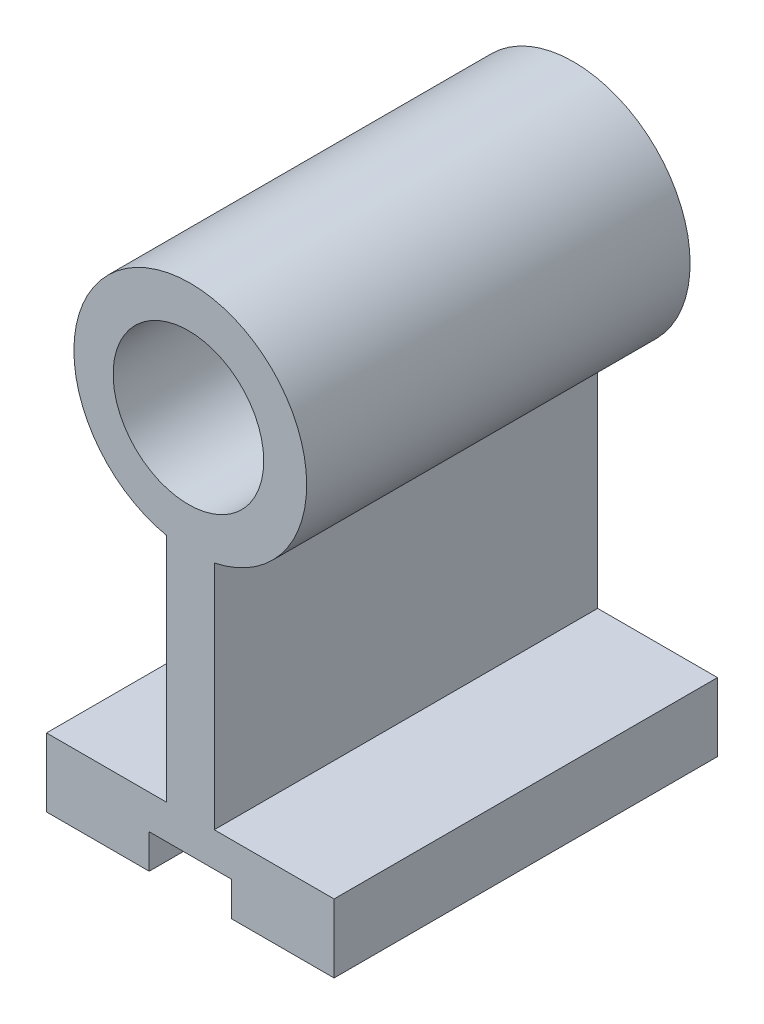
ISO-10303-21;
HEADER;
FILE_DESCRIPTION(('STEP AP214'),'2;1');
FILE_NAME('part.step','',(''),(''),'','','');
FILE_SCHEMA(('AUTOMOTIVE_DESIGN { 1 0 10303 214 1 1 1 1 }'));
ENDSEC;
DATA;
#1=APPLICATION_CONTEXT('core data for automotive mechanical design processes');
#2=APPLICATION_PROTOCOL_DEFINITION('international standard','automotive_design',2000,#1);
#3=PRODUCT_CONTEXT('',#1,'mechanical');
#4=PRODUCT('Part','Part','',(#3));
#5=PRODUCT_RELATED_PRODUCT_CATEGORY('part','',(#4));
#6=PRODUCT_DEFINITION_FORMATION('','',#4);
#7=PRODUCT_DEFINITION_CONTEXT('part definition',#1,'design');
#8=PRODUCT_DEFINITION('design','',#6,#7);
#9=PRODUCT_DEFINITION_SHAPE('','',#8);
#10=(LENGTH_UNIT() NAMED_UNIT(*) SI_UNIT(.MILLI.,.METRE.));
#11=(NAMED_UNIT(*) PLANE_ANGLE_UNIT() SI_UNIT($,.RADIAN.));
#12=(NAMED_UNIT(*) SI_UNIT($,.STERADIAN.) SOLID_ANGLE_UNIT());
#13=UNCERTAINTY_MEASURE_WITH_UNIT(LENGTH_MEASURE(1.E-05),#10,'distance_accuracy_value','');
#14=(GEOMETRIC_REPRESENTATION_CONTEXT(3) GLOBAL_UNCERTAINTY_ASSIGNED_CONTEXT((#13)) GLOBAL_UNIT_ASSIGNED_CONTEXT((#10,
#11,#12)) REPRESENTATION_CONTEXT('',''));
#15=CARTESIAN_POINT('',(0.,0.,0.));
#16=DIRECTION('',(0.,0.,1.));
#17=DIRECTION('',(1.,0.,0.));
#18=AXIS2_PLACEMENT_3D('',#15,#16,#17);
#19=CARTESIAN_POINT('',(6.,60.3863756322954,56.));
#20=DIRECTION('',(0.,0.,1.));
#21=DIRECTION('',(1.,0.,0.));
#22=AXIS2_PLACEMENT_3D('',#19,#20,#21);
#23=PLANE('',#22);
#24=DIRECTION('',(0.,1.,0.));
#25=VECTOR('',#24,1.);
#26=CARTESIAN_POINT('',(0.,5.,56.));
#27=LINE('',#26,#25);
#28=CARTESIAN_POINT('',(0.,0.,56.));
#29=VERTEX_POINT('',#28);
#30=CARTESIAN_POINT('',(0.,5.,56.));
#31=VERTEX_POINT('',#30);
#32=EDGE_CURVE('E200',#29,#31,#27,.T.);
#33=ORIENTED_EDGE('',*,*,#32,.T.);
#34=DIRECTION('',(1.,0.,0.));
#35=VECTOR('',#34,1.);
#36=CARTESIAN_POINT('',(12.,5.,56.));
#37=LINE('',#36,#35);
#38=CARTESIAN_POINT('',(12.,5.,56.));
#39=VERTEX_POINT('',#38);
#40=EDGE_CURVE('E112',#31,#39,#37,.T.);
#41=ORIENTED_EDGE('',*,*,#40,.T.);
#42=DIRECTION('',(0.,-1.,0.));
#43=VECTOR('',#42,1.);
#44=CARTESIAN_POINT('',(12.,0.,56.));
#45=LINE('',#44,#43);
#46=CARTESIAN_POINT('',(12.,0.,56.));
#47=VERTEX_POINT('',#46);
#48=EDGE_CURVE('E237',#39,#47,#45,.T.);
#49=ORIENTED_EDGE('',*,*,#48,.T.);
#50=DIRECTION('',(1.,0.,0.));
#51=VECTOR('',#50,1.);
#52=CARTESIAN_POINT('',(27.,0.,56.));
#53=LINE('',#52,#51);
#54=CARTESIAN_POINT('',(27.,0.,56.));
#55=VERTEX_POINT('',#54);
#56=EDGE_CURVE('E257',#47,#55,#53,.T.);
#57=ORIENTED_EDGE('',*,*,#56,.T.);
#58=DIRECTION('',(0.,1.,0.));
#59=VECTOR('',#58,1.);
#60=CARTESIAN_POINT('',(27.,9.99999999999999,56.));
#61=LINE('',#60,#59);
#62=CARTESIAN_POINT('',(27.,9.99999999999999,56.));
#63=VERTEX_POINT('',#62);
#64=EDGE_CURVE('E253',#55,#63,#61,.T.);
#65=ORIENTED_EDGE('',*,*,#64,.T.);
#66=DIRECTION('',(-1.,0.,0.));
#67=VECTOR('',#66,1.);
#68=CARTESIAN_POINT('',(9.5,9.99999999999999,56.));
#69=LINE('',#68,#67);
#70=CARTESIAN_POINT('',(9.5,9.99999999999999,56.));
#71=VERTEX_POINT('',#70);
#72=EDGE_CURVE('E256',#63,#71,#69,.T.);
#73=ORIENTED_EDGE('',*,*,#72,.T.);
#74=DIRECTION('',(0.,1.,0.));
#75=VECTOR('',#74,1.);
#76=CARTESIAN_POINT('',(9.5,43.7505708726813,56.));
#77=LINE('',#76,#75);
#78=CARTESIAN_POINT('',(9.5,43.7505708726813,56.));
#79=VERTEX_POINT('',#78);
#80=EDGE_CURVE('E261',#71,#79,#77,.T.);
#81=ORIENTED_EDGE('',*,*,#80,.T.);
#82=CARTESIAN_POINT('',(6.,60.3863756322954,56.));
#83=DIRECTION('',(0.,0.,1.));
#84=DIRECTION('',(1.,0.,0.));
#85=AXIS2_PLACEMENT_3D('',#82,#83,#84);
#86=CIRCLE('',#85,17.);
#87=CARTESIAN_POINT('',(2.5,43.7505708726813,56.));
#88=VERTEX_POINT('',#87);
#89=EDGE_CURVE('E268',#79,#88,#86,.T.);
#90=ORIENTED_EDGE('',*,*,#89,.T.);
#91=DIRECTION('',(0.,-1.,0.));
#92=VECTOR('',#91,1.);
#93=CARTESIAN_POINT('',(2.5,10.,56.));
#94=LINE('',#93,#92);
#95=CARTESIAN_POINT('',(2.5,10.,56.));
#96=VERTEX_POINT('',#95);
#97=EDGE_CURVE('E143',#88,#96,#94,.T.);
#98=ORIENTED_EDGE('',*,*,#97,.T.);
#99=DIRECTION('',(-1.,0.,0.));
#100=VECTOR('',#99,1.);
#101=CARTESIAN_POINT('',(-15.,10.,56.));
#102=LINE('',#101,#100);
#103=CARTESIAN_POINT('',(-15.,10.,56.));
#104=VERTEX_POINT('',#103);
#105=EDGE_CURVE('E137',#96,#104,#102,.T.);
#106=ORIENTED_EDGE('',*,*,#105,.T.);
#107=DIRECTION('',(0.,-1.,0.));
#108=VECTOR('',#107,1.);
#109=CARTESIAN_POINT('',(-15.,0.,56.));
#110=LINE('',#109,#108);
#111=CARTESIAN_POINT('',(-15.,0.,56.));
#112=VERTEX_POINT('',#111);
#113=EDGE_CURVE('E141',#104,#112,#110,.T.);
#114=ORIENTED_EDGE('',*,*,#113,.T.);
#115=DIRECTION('',(1.,0.,0.));
#116=VECTOR('',#115,1.);
#117=CARTESIAN_POINT('',(0.,0.,56.));
#118=LINE('',#117,#116);
#119=EDGE_CURVE('E57',#112,#29,#118,.T.);
#120=ORIENTED_EDGE('',*,*,#119,.T.);
#121=EDGE_LOOP('',(#33,#41,#49,#57,#65,#73,#81,#90,#98,#106,#114,#120));
#122=FACE_BOUND('',#121,.T.);
#123=CARTESIAN_POINT('',(5.7280236249352,60.2566811916231,56.));
#124=DIRECTION('',(0.,0.,1.));
#125=DIRECTION('',(1.,0.,0.));
#126=AXIS2_PLACEMENT_3D('',#123,#124,#125);
#127=CIRCLE('',#126,11.);
#128=CARTESIAN_POINT('',(16.7280236249352,60.2566811916231,56.));
#129=VERTEX_POINT('',#128);
#130=EDGE_CURVE('E170',#129,#129,#127,.T.);
#131=ORIENTED_EDGE('',*,*,#130,.F.);
#132=EDGE_LOOP('',(#131));
#133=FACE_BOUND('',#132,.T.);
#134=ADVANCED_FACE('F39',(#122,#133),#23,.T.);
#135=CARTESIAN_POINT('',(6.,60.3863756322954,0.));
#136=DIRECTION('',(0.,0.,1.));
#137=DIRECTION('',(1.,0.,0.));
#138=AXIS2_PLACEMENT_3D('',#135,#136,#137);
#139=PLANE('',#138);
#140=DIRECTION('',(0.,1.,0.));
#141=VECTOR('',#140,1.);
#142=CARTESIAN_POINT('',(0.,5.,0.));
#143=LINE('',#142,#141);
#144=CARTESIAN_POINT('',(0.,0.,0.));
#145=VERTEX_POINT('',#144);
#146=CARTESIAN_POINT('',(0.,5.,0.));
#147=VERTEX_POINT('',#146);
#148=EDGE_CURVE('E165',#145,#147,#143,.T.);
#149=ORIENTED_EDGE('',*,*,#148,.F.);
#150=DIRECTION('',(1.,0.,0.));
#151=VECTOR('',#150,1.);
#152=CARTESIAN_POINT('',(0.,0.,0.));
#153=LINE('',#152,#151);
#154=CARTESIAN_POINT('',(-15.,0.,0.));
#155=VERTEX_POINT('',#154);
#156=EDGE_CURVE('E104',#155,#145,#153,.T.);
#157=ORIENTED_EDGE('',*,*,#156,.F.);
#158=DIRECTION('',(0.,-1.,0.));
#159=VECTOR('',#158,1.);
#160=CARTESIAN_POINT('',(-15.,0.,0.));
#161=LINE('',#160,#159);
#162=CARTESIAN_POINT('',(-15.,10.,0.));
#163=VERTEX_POINT('',#162);
#164=EDGE_CURVE('E98',#163,#155,#161,.T.);
#165=ORIENTED_EDGE('',*,*,#164,.F.);
#166=DIRECTION('',(-1.,0.,0.));
#167=VECTOR('',#166,1.);
#168=CARTESIAN_POINT('',(-15.,10.,0.));
#169=LINE('',#168,#167);
#170=CARTESIAN_POINT('',(2.5,10.,0.));
#171=VERTEX_POINT('',#170);
#172=EDGE_CURVE('E152',#171,#163,#169,.T.);
#173=ORIENTED_EDGE('',*,*,#172,.F.);
#174=DIRECTION('',(0.,-1.,0.));
#175=VECTOR('',#174,1.);
#176=CARTESIAN_POINT('',(2.5,10.,0.));
#177=LINE('',#176,#175);
#178=CARTESIAN_POINT('',(2.5,43.7505708726813,0.));
#179=VERTEX_POINT('',#178);
#180=EDGE_CURVE('E191',#179,#171,#177,.T.);
#181=ORIENTED_EDGE('',*,*,#180,.F.);
#182=CARTESIAN_POINT('',(6.,60.3863756322954,0.));
#183=DIRECTION('',(0.,0.,1.));
#184=DIRECTION('',(1.,0.,0.));
#185=AXIS2_PLACEMENT_3D('',#182,#183,#184);
#186=CIRCLE('',#185,17.);
#187=CARTESIAN_POINT('',(9.5,43.7505708726813,0.));
#188=VERTEX_POINT('',#187);
#189=EDGE_CURVE('E188',#188,#179,#186,.T.);
#190=ORIENTED_EDGE('',*,*,#189,.F.);
#191=DIRECTION('',(0.,1.,0.));
#192=VECTOR('',#191,1.);
#193=CARTESIAN_POINT('',(9.5,43.7505708726813,0.));
#194=LINE('',#193,#192);
#195=CARTESIAN_POINT('',(9.5,9.99999999999999,0.));
#196=VERTEX_POINT('',#195);
#197=EDGE_CURVE('E185',#196,#188,#194,.T.);
#198=ORIENTED_EDGE('',*,*,#197,.F.);
#199=DIRECTION('',(-1.,0.,0.));
#200=VECTOR('',#199,1.);
#201=CARTESIAN_POINT('',(9.5,9.99999999999999,0.));
#202=LINE('',#201,#200);
#203=CARTESIAN_POINT('',(27.,9.99999999999999,0.));
#204=VERTEX_POINT('',#203);
#205=EDGE_CURVE('E182',#204,#196,#202,.T.);
#206=ORIENTED_EDGE('',*,*,#205,.F.);
#207=DIRECTION('',(0.,1.,0.));
#208=VECTOR('',#207,1.);
#209=CARTESIAN_POINT('',(27.,9.99999999999999,0.));
#210=LINE('',#209,#208);
#211=CARTESIAN_POINT('',(27.,0.,0.));
#212=VERTEX_POINT('',#211);
#213=EDGE_CURVE('E179',#212,#204,#210,.T.);
#214=ORIENTED_EDGE('',*,*,#213,.F.);
#215=DIRECTION('',(1.,0.,0.));
#216=VECTOR('',#215,1.);
#217=CARTESIAN_POINT('',(27.,0.,0.));
#218=LINE('',#217,#216);
#219=CARTESIAN_POINT('',(12.,0.,0.));
#220=VERTEX_POINT('',#219);
#221=EDGE_CURVE('E176',#220,#212,#218,.T.);
#222=ORIENTED_EDGE('',*,*,#221,.F.);
#223=DIRECTION('',(0.,-1.,0.));
#224=VECTOR('',#223,1.);
#225=CARTESIAN_POINT('',(12.,0.,0.));
#226=LINE('',#225,#224);
#227=CARTESIAN_POINT('',(12.,5.,0.));
#228=VERTEX_POINT('',#227);
#229=EDGE_CURVE('E173',#228,#220,#226,.T.);
#230=ORIENTED_EDGE('',*,*,#229,.F.);
#231=DIRECTION('',(1.,0.,0.));
#232=VECTOR('',#231,1.);
#233=CARTESIAN_POINT('',(12.,5.,0.));
#234=LINE('',#233,#232);
#235=EDGE_CURVE('E169',#147,#228,#234,.T.);
#236=ORIENTED_EDGE('',*,*,#235,.F.);
#237=EDGE_LOOP('',(#149,#157,#165,#173,#181,#190,#198,#206,#214,#222,#230,#236));
#238=FACE_BOUND('',#237,.T.);
#239=CARTESIAN_POINT('',(5.7280236249352,60.2566811916231,0.));
#240=DIRECTION('',(0.,0.,1.));
#241=DIRECTION('',(1.,0.,0.));
#242=AXIS2_PLACEMENT_3D('',#239,#240,#241);
#243=CIRCLE('',#242,11.);
#244=CARTESIAN_POINT('',(16.7280236249352,60.2566811916231,0.));
#245=VERTEX_POINT('',#244);
#246=EDGE_CURVE('E417',#245,#245,#243,.T.);
#247=ORIENTED_EDGE('',*,*,#246,.T.);
#248=EDGE_LOOP('',(#247));
#249=FACE_BOUND('',#248,.T.);
#250=ADVANCED_FACE('F241',(#238,#249),#139,.F.);
#251=CARTESIAN_POINT('',(0.,5.,56.));
#252=DIRECTION('',(-1.,0.,0.));
#253=DIRECTION('',(0.,0.,1.));
#254=AXIS2_PLACEMENT_3D('',#251,#252,#253);
#255=PLANE('',#254);
#256=ORIENTED_EDGE('',*,*,#148,.T.);
#257=DIRECTION('',(0.,0.,-1.));
#258=VECTOR('',#257,1.);
#259=CARTESIAN_POINT('',(0.,5.,56.));
#260=LINE('',#259,#258);
#261=EDGE_CURVE('E11',#31,#147,#260,.T.);
#262=ORIENTED_EDGE('',*,*,#261,.F.);
#263=ORIENTED_EDGE('',*,*,#32,.F.);
#264=DIRECTION('',(0.,0.,-1.));
#265=VECTOR('',#264,1.);
#266=CARTESIAN_POINT('',(0.,0.,56.));
#267=LINE('',#266,#265);
#268=EDGE_CURVE('E161',#29,#145,#267,.T.);
#269=ORIENTED_EDGE('',*,*,#268,.T.);
#270=EDGE_LOOP('',(#256,#262,#263,#269));
#271=FACE_BOUND('',#270,.T.);
#272=ADVANCED_FACE('F41',(#271),#255,.F.);
#273=CARTESIAN_POINT('',(12.,5.,56.));
#274=DIRECTION('',(0.,1.,0.));
#275=DIRECTION('',(-1.,0.,0.));
#276=AXIS2_PLACEMENT_3D('',#273,#274,#275);
#277=PLANE('',#276);
#278=ORIENTED_EDGE('',*,*,#235,.T.);
#279=DIRECTION('',(0.,0.,-1.));
#280=VECTOR('',#279,1.);
#281=CARTESIAN_POINT('',(12.,5.,56.));
#282=LINE('',#281,#280);
#283=EDGE_CURVE('E49',#39,#228,#282,.T.);
#284=ORIENTED_EDGE('',*,*,#283,.F.);
#285=ORIENTED_EDGE('',*,*,#40,.F.);
#286=ORIENTED_EDGE('',*,*,#261,.T.);
#287=EDGE_LOOP('',(#278,#284,#285,#286));
#288=FACE_BOUND('',#287,.T.);
#289=ADVANCED_FACE('F304',(#288),#277,.F.);
#290=CARTESIAN_POINT('',(12.,0.,56.));
#291=DIRECTION('',(1.,0.,0.));
#292=DIRECTION('',(0.,0.,-1.));
#293=AXIS2_PLACEMENT_3D('',#290,#291,#292);
#294=PLANE('',#293);
#295=ORIENTED_EDGE('',*,*,#229,.T.);
#296=DIRECTION('',(0.,0.,-1.));
#297=VECTOR('',#296,1.);
#298=CARTESIAN_POINT('',(12.,0.,56.));
#299=LINE('',#298,#297);
#300=EDGE_CURVE('E227',#47,#220,#299,.T.);
#301=ORIENTED_EDGE('',*,*,#300,.F.);
#302=ORIENTED_EDGE('',*,*,#48,.F.);
#303=ORIENTED_EDGE('',*,*,#283,.T.);
#304=EDGE_LOOP('',(#295,#301,#302,#303));
#305=FACE_BOUND('',#304,.T.);
#306=ADVANCED_FACE('F235',(#305),#294,.F.);
#307=CARTESIAN_POINT('',(27.,0.,56.));
#308=DIRECTION('',(0.,1.,0.));
#309=DIRECTION('',(-1.,0.,0.));
#310=AXIS2_PLACEMENT_3D('',#307,#308,#309);
#311=PLANE('',#310);
#312=ORIENTED_EDGE('',*,*,#221,.T.);
#313=DIRECTION('',(0.,0.,-1.));
#314=VECTOR('',#313,1.);
#315=CARTESIAN_POINT('',(27.,0.,56.));
#316=LINE('',#315,#314);
#317=EDGE_CURVE('E223',#55,#212,#316,.T.);
#318=ORIENTED_EDGE('',*,*,#317,.F.);
#319=ORIENTED_EDGE('',*,*,#56,.F.);
#320=ORIENTED_EDGE('',*,*,#300,.T.);
#321=EDGE_LOOP('',(#312,#318,#319,#320));
#322=FACE_BOUND('',#321,.T.);
#323=ADVANCED_FACE('F247',(#322),#311,.F.);
#324=CARTESIAN_POINT('',(27.,9.99999999999999,56.));
#325=DIRECTION('',(-1.,0.,0.));
#326=DIRECTION('',(0.,0.,1.));
#327=AXIS2_PLACEMENT_3D('',#324,#325,#326);
#328=PLANE('',#327);
#329=ORIENTED_EDGE('',*,*,#213,.T.);
#330=DIRECTION('',(0.,0.,-1.));
#331=VECTOR('',#330,1.);
#332=CARTESIAN_POINT('',(27.,9.99999999999999,56.));
#333=LINE('',#332,#331);
#334=EDGE_CURVE('E219',#63,#204,#333,.T.);
#335=ORIENTED_EDGE('',*,*,#334,.F.);
#336=ORIENTED_EDGE('',*,*,#64,.F.);
#337=ORIENTED_EDGE('',*,*,#317,.T.);
#338=EDGE_LOOP('',(#329,#335,#336,#337));
#339=FACE_BOUND('',#338,.T.);
#340=ADVANCED_FACE('F251',(#339),#328,.F.);
#341=CARTESIAN_POINT('',(9.5,9.99999999999999,56.));
#342=DIRECTION('',(0.,-1.,0.));
#343=DIRECTION('',(0.,0.,-1.));
#344=AXIS2_PLACEMENT_3D('',#341,#342,#343);
#345=PLANE('',#344);
#346=ORIENTED_EDGE('',*,*,#205,.T.);
#347=DIRECTION('',(0.,0.,-1.));
#348=VECTOR('',#347,1.);
#349=CARTESIAN_POINT('',(9.5,9.99999999999999,56.));
#350=LINE('',#349,#348);
#351=EDGE_CURVE('E215',#71,#196,#350,.T.);
#352=ORIENTED_EDGE('',*,*,#351,.F.);
#353=ORIENTED_EDGE('',*,*,#72,.F.);
#354=ORIENTED_EDGE('',*,*,#334,.T.);
#355=EDGE_LOOP('',(#346,#352,#353,#354));
#356=FACE_BOUND('',#355,.T.);
#357=ADVANCED_FACE('F317',(#356),#345,.F.);
#358=CARTESIAN_POINT('',(9.5,43.7505708726813,56.));
#359=DIRECTION('',(-1.,0.,0.));
#360=DIRECTION('',(0.,0.,1.));
#361=AXIS2_PLACEMENT_3D('',#358,#359,#360);
#362=PLANE('',#361);
#363=ORIENTED_EDGE('',*,*,#197,.T.);
#364=DIRECTION('',(0.,0.,-1.));
#365=VECTOR('',#364,1.);
#366=CARTESIAN_POINT('',(9.5,43.7505708726813,56.));
#367=LINE('',#366,#365);
#368=EDGE_CURVE('E211',#79,#188,#367,.T.);
#369=ORIENTED_EDGE('',*,*,#368,.F.);
#370=ORIENTED_EDGE('',*,*,#80,.F.);
#371=ORIENTED_EDGE('',*,*,#351,.T.);
#372=EDGE_LOOP('',(#363,#369,#370,#371));
#373=FACE_BOUND('',#372,.T.);
#374=ADVANCED_FACE('F320',(#373),#362,.F.);
#375=CARTESIAN_POINT('',(6.,60.3863756322954,56.));
#376=DIRECTION('',(0.,0.,-1.));
#377=DIRECTION('',(-1.,0.,0.));
#378=AXIS2_PLACEMENT_3D('',#375,#376,#377);
#379=CYLINDRICAL_SURFACE('',#378,17.);
#380=ORIENTED_EDGE('',*,*,#189,.T.);
#381=DIRECTION('',(0.,0.,-1.));
#382=VECTOR('',#381,1.);
#383=CARTESIAN_POINT('',(2.5,43.7505708726813,56.));
#384=LINE('',#383,#382);
#385=EDGE_CURVE('E207',#88,#179,#384,.T.);
#386=ORIENTED_EDGE('',*,*,#385,.F.);
#387=ORIENTED_EDGE('',*,*,#89,.F.);
#388=ORIENTED_EDGE('',*,*,#368,.T.);
#389=EDGE_LOOP('',(#380,#386,#387,#388));
#390=FACE_BOUND('',#389,.T.);
#391=ADVANCED_FACE('F276',(#390),#379,.T.);
#392=CARTESIAN_POINT('',(2.5,10.,56.));
#393=DIRECTION('',(1.,0.,0.));
#394=DIRECTION('',(0.,0.,-1.));
#395=AXIS2_PLACEMENT_3D('',#392,#393,#394);
#396=PLANE('',#395);
#397=ORIENTED_EDGE('',*,*,#180,.T.);
#398=DIRECTION('',(0.,0.,-1.));
#399=VECTOR('',#398,1.);
#400=CARTESIAN_POINT('',(2.5,10.,56.));
#401=LINE('',#400,#399);
#402=EDGE_CURVE('E154',#96,#171,#401,.T.);
#403=ORIENTED_EDGE('',*,*,#402,.F.);
#404=ORIENTED_EDGE('',*,*,#97,.F.);
#405=ORIENTED_EDGE('',*,*,#385,.T.);
#406=EDGE_LOOP('',(#397,#403,#404,#405));
#407=FACE_BOUND('',#406,.T.);
#408=ADVANCED_FACE('F280',(#407),#396,.F.);
#409=CARTESIAN_POINT('',(-15.,10.,56.));
#410=DIRECTION('',(0.,-1.,0.));
#411=DIRECTION('',(0.,0.,-1.));
#412=AXIS2_PLACEMENT_3D('',#409,#410,#411);
#413=PLANE('',#412);
#414=ORIENTED_EDGE('',*,*,#172,.T.);
#415=DIRECTION('',(0.,0.,-1.));
#416=VECTOR('',#415,1.);
#417=CARTESIAN_POINT('',(-15.,10.,56.));
#418=LINE('',#417,#416);
#419=EDGE_CURVE('E149',#104,#163,#418,.T.);
#420=ORIENTED_EDGE('',*,*,#419,.F.);
#421=ORIENTED_EDGE('',*,*,#105,.F.);
#422=ORIENTED_EDGE('',*,*,#402,.T.);
#423=EDGE_LOOP('',(#414,#420,#421,#422));
#424=FACE_BOUND('',#423,.T.);
#425=ADVANCED_FACE('F150',(#424),#413,.F.);
#426=CARTESIAN_POINT('',(-15.,0.,56.));
#427=DIRECTION('',(1.,0.,0.));
#428=DIRECTION('',(0.,0.,-1.));
#429=AXIS2_PLACEMENT_3D('',#426,#427,#428);
#430=PLANE('',#429);
#431=ORIENTED_EDGE('',*,*,#164,.T.);
#432=DIRECTION('',(0.,0.,-1.));
#433=VECTOR('',#432,1.);
#434=CARTESIAN_POINT('',(-15.,0.,56.));
#435=LINE('',#434,#433);
#436=EDGE_CURVE('E155',#112,#155,#435,.T.);
#437=ORIENTED_EDGE('',*,*,#436,.F.);
#438=ORIENTED_EDGE('',*,*,#113,.F.);
#439=ORIENTED_EDGE('',*,*,#419,.T.);
#440=EDGE_LOOP('',(#431,#437,#438,#439));
#441=FACE_BOUND('',#440,.T.);
#442=ADVANCED_FACE('F157',(#441),#430,.F.);
#443=CARTESIAN_POINT('',(0.,0.,56.));
#444=DIRECTION('',(0.,1.,0.));
#445=DIRECTION('',(0.,0.,1.));
#446=AXIS2_PLACEMENT_3D('',#443,#444,#445);
#447=PLANE('',#446);
#448=ORIENTED_EDGE('',*,*,#156,.T.);
#449=ORIENTED_EDGE('',*,*,#268,.F.);
#450=ORIENTED_EDGE('',*,*,#119,.F.);
#451=ORIENTED_EDGE('',*,*,#436,.T.);
#452=EDGE_LOOP('',(#448,#449,#450,#451));
#453=FACE_BOUND('',#452,.T.);
#454=ADVANCED_FACE('F284',(#453),#447,.F.);
#455=CARTESIAN_POINT('',(5.7280236249352,60.2566811916231,56.));
#456=DIRECTION('',(0.,0.,-1.));
#457=DIRECTION('',(-1.,0.,0.));
#458=AXIS2_PLACEMENT_3D('',#455,#456,#457);
#459=CYLINDRICAL_SURFACE('',#458,11.);
#460=ORIENTED_EDGE('',*,*,#130,.T.);
#461=EDGE_LOOP('',(#460));
#462=FACE_BOUND('',#461,.T.);
#463=ORIENTED_EDGE('',*,*,#246,.F.);
#464=EDGE_LOOP('',(#463));
#465=FACE_BOUND('',#464,.T.);
#466=ADVANCED_FACE('F286',(#462,#465),#459,.F.);
#467=CLOSED_SHELL('',(#134,#250,#272,#289,#306,#323,#340,#357,#374,#391,#408,#425,#442,#454,#466));
#468=MANIFOLD_SOLID_BREP('B2',#467);
#469=ADVANCED_BREP_SHAPE_REPRESENTATION('',(#18,#468),#14);
#470=SHAPE_DEFINITION_REPRESENTATION(#9,#469);
ENDSEC;
END-ISO-10303-21;
